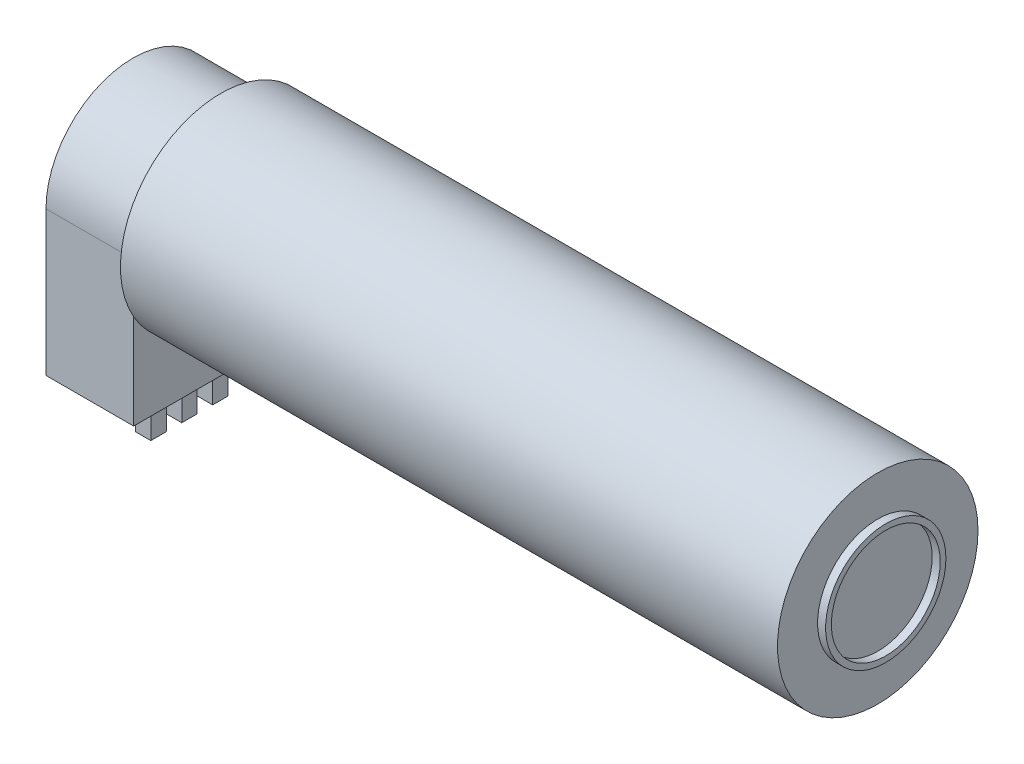
ISO-10303-21;
HEADER;
FILE_DESCRIPTION(('STEP AP214'),'2;1');
FILE_NAME('part.step','',(''),(''),'','','');
FILE_SCHEMA(('AUTOMOTIVE_DESIGN { 1 0 10303 214 1 1 1 1 }'));
ENDSEC;
DATA;
#1=APPLICATION_CONTEXT('core data for automotive mechanical design processes');
#2=APPLICATION_PROTOCOL_DEFINITION('international standard','automotive_design',2000,#1);
#3=PRODUCT_CONTEXT('',#1,'mechanical');
#4=PRODUCT('Part','Part','',(#3));
#5=PRODUCT_RELATED_PRODUCT_CATEGORY('part','',(#4));
#6=PRODUCT_DEFINITION_FORMATION('','',#4);
#7=PRODUCT_DEFINITION_CONTEXT('part definition',#1,'design');
#8=PRODUCT_DEFINITION('design','',#6,#7);
#9=PRODUCT_DEFINITION_SHAPE('','',#8);
#10=(LENGTH_UNIT() NAMED_UNIT(*) SI_UNIT(.MILLI.,.METRE.));
#11=(NAMED_UNIT(*) PLANE_ANGLE_UNIT() SI_UNIT($,.RADIAN.));
#12=(NAMED_UNIT(*) SI_UNIT($,.STERADIAN.) SOLID_ANGLE_UNIT());
#13=UNCERTAINTY_MEASURE_WITH_UNIT(LENGTH_MEASURE(1.E-05),#10,'distance_accuracy_value','');
#14=(GEOMETRIC_REPRESENTATION_CONTEXT(3) GLOBAL_UNCERTAINTY_ASSIGNED_CONTEXT((#13)) GLOBAL_UNIT_ASSIGNED_CONTEXT((#10,
#11,#12)) REPRESENTATION_CONTEXT('',''));
#15=CARTESIAN_POINT('',(0.,0.,0.));
#16=DIRECTION('',(0.,0.,1.));
#17=DIRECTION('',(1.,0.,0.));
#18=AXIS2_PLACEMENT_3D('',#15,#16,#17);
#19=CARTESIAN_POINT('',(-15.3,-25.2,-15.2));
#20=DIRECTION('',(0.,1.,0.));
#21=DIRECTION('',(0.,0.,1.));
#22=AXIS2_PLACEMENT_3D('',#19,#20,#21);
#23=PLANE('',#22);
#24=DIRECTION('',(1.,0.,0.));
#25=VECTOR('',#24,1.);
#26=CARTESIAN_POINT('',(-6.,-25.2,3.5));
#27=LINE('',#26,#25);
#28=CARTESIAN_POINT('',(-6.,-25.2,3.5));
#29=VERTEX_POINT('',#28);
#30=CARTESIAN_POINT('',(-5.3,-25.2,3.5));
#31=VERTEX_POINT('',#30);
#32=EDGE_CURVE('E211',#29,#31,#27,.T.);
#33=ORIENTED_EDGE('',*,*,#32,.F.);
#34=DIRECTION('',(0.,0.,1.));
#35=VECTOR('',#34,1.);
#36=CARTESIAN_POINT('',(-6.,-25.2,3.5));
#37=LINE('',#36,#35);
#38=CARTESIAN_POINT('',(-6.,-25.2,4.2));
#39=VERTEX_POINT('',#38);
#40=EDGE_CURVE('E219',#29,#39,#37,.T.);
#41=ORIENTED_EDGE('',*,*,#40,.T.);
#42=DIRECTION('',(1.,0.,0.));
#43=VECTOR('',#42,1.);
#44=CARTESIAN_POINT('',(-6.,-25.2,4.2));
#45=LINE('',#44,#43);
#46=CARTESIAN_POINT('',(-5.3,-25.2,4.2));
#47=VERTEX_POINT('',#46);
#48=EDGE_CURVE('E226',#39,#47,#45,.T.);
#49=ORIENTED_EDGE('',*,*,#48,.T.);
#50=DIRECTION('',(0.,0.,1.));
#51=VECTOR('',#50,1.);
#52=CARTESIAN_POINT('',(-5.3,-25.2,3.5));
#53=LINE('',#52,#51);
#54=EDGE_CURVE('E51',#31,#47,#53,.T.);
#55=ORIENTED_EDGE('',*,*,#54,.F.);
#56=EDGE_LOOP('',(#33,#41,#49,#55));
#57=FACE_BOUND('',#56,.T.);
#58=DIRECTION('',(1.,0.,0.));
#59=VECTOR('',#58,1.);
#60=CARTESIAN_POINT('',(-6.,-25.2,-1.9));
#61=LINE('',#60,#59);
#62=CARTESIAN_POINT('',(-6.,-25.2,-1.9));
#63=VERTEX_POINT('',#62);
#64=CARTESIAN_POINT('',(-5.3,-25.2,-1.9));
#65=VERTEX_POINT('',#64);
#66=EDGE_CURVE('E246',#63,#65,#61,.T.);
#67=ORIENTED_EDGE('',*,*,#66,.F.);
#68=DIRECTION('',(0.,0.,1.));
#69=VECTOR('',#68,1.);
#70=CARTESIAN_POINT('',(-6.,-25.2,-1.9));
#71=LINE('',#70,#69);
#72=CARTESIAN_POINT('',(-6.,-25.2,-1.2));
#73=VERTEX_POINT('',#72);
#74=EDGE_CURVE('E225',#63,#73,#71,.T.);
#75=ORIENTED_EDGE('',*,*,#74,.T.);
#76=DIRECTION('',(1.,0.,0.));
#77=VECTOR('',#76,1.);
#78=CARTESIAN_POINT('',(-6.,-25.2,-1.2));
#79=LINE('',#78,#77);
#80=CARTESIAN_POINT('',(-5.3,-25.2,-1.2));
#81=VERTEX_POINT('',#80);
#82=EDGE_CURVE('E256',#73,#81,#79,.T.);
#83=ORIENTED_EDGE('',*,*,#82,.T.);
#84=DIRECTION('',(0.,0.,1.));
#85=VECTOR('',#84,1.);
#86=CARTESIAN_POINT('',(-5.3,-25.2,-1.9));
#87=LINE('',#86,#85);
#88=EDGE_CURVE('E59',#65,#81,#87,.T.);
#89=ORIENTED_EDGE('',*,*,#88,.F.);
#90=EDGE_LOOP('',(#67,#75,#83,#89));
#91=FACE_BOUND('',#90,.T.);
#92=DIRECTION('',(1.,0.,0.));
#93=VECTOR('',#92,1.);
#94=CARTESIAN_POINT('',(-7.,-25.2,-0.199999999999999));
#95=LINE('',#94,#93);
#96=CARTESIAN_POINT('',(-7.,-25.2,-0.199999999999999));
#97=VERTEX_POINT('',#96);
#98=CARTESIAN_POINT('',(-4.3,-25.2,-0.199999999999999));
#99=VERTEX_POINT('',#98);
#100=EDGE_CURVE('E320',#97,#99,#95,.T.);
#101=ORIENTED_EDGE('',*,*,#100,.F.);
#102=DIRECTION('',(0.,0.,1.));
#103=VECTOR('',#102,1.);
#104=CARTESIAN_POINT('',(-7.,-25.2,-0.199999999999999));
#105=LINE('',#104,#103);
#106=CARTESIAN_POINT('',(-7.,-25.2,2.5));
#107=VERTEX_POINT('',#106);
#108=EDGE_CURVE('E310',#97,#107,#105,.T.);
#109=ORIENTED_EDGE('',*,*,#108,.T.);
#110=DIRECTION('',(1.,0.,0.));
#111=VECTOR('',#110,1.);
#112=CARTESIAN_POINT('',(-7.,-25.2,2.5));
#113=LINE('',#112,#111);
#114=CARTESIAN_POINT('',(-4.3,-25.2,2.5));
#115=VERTEX_POINT('',#114);
#116=EDGE_CURVE('E313',#107,#115,#113,.T.);
#117=ORIENTED_EDGE('',*,*,#116,.T.);
#118=DIRECTION('',(0.,0.,1.));
#119=VECTOR('',#118,1.);
#120=CARTESIAN_POINT('',(-4.3,-25.2,-0.199999999999999));
#121=LINE('',#120,#119);
#122=EDGE_CURVE('E317',#99,#115,#121,.T.);
#123=ORIENTED_EDGE('',*,*,#122,.F.);
#124=EDGE_LOOP('',(#101,#109,#117,#123));
#125=FACE_BOUND('',#124,.T.);
#126=DIRECTION('',(1.,0.,0.));
#127=VECTOR('',#126,1.);
#128=CARTESIAN_POINT('',(-7.,-25.2,5.2));
#129=LINE('',#128,#127);
#130=CARTESIAN_POINT('',(-7.,-25.2,5.2));
#131=VERTEX_POINT('',#130);
#132=CARTESIAN_POINT('',(-4.3,-25.2,5.2));
#133=VERTEX_POINT('',#132);
#134=EDGE_CURVE('E337',#131,#133,#129,.T.);
#135=ORIENTED_EDGE('',*,*,#134,.F.);
#136=DIRECTION('',(0.,0.,1.));
#137=VECTOR('',#136,1.);
#138=CARTESIAN_POINT('',(-7.,-25.2,5.2));
#139=LINE('',#138,#137);
#140=CARTESIAN_POINT('',(-7.,-25.2,7.9));
#141=VERTEX_POINT('',#140);
#142=EDGE_CURVE('E323',#131,#141,#139,.T.);
#143=ORIENTED_EDGE('',*,*,#142,.T.);
#144=DIRECTION('',(1.,0.,0.));
#145=VECTOR('',#144,1.);
#146=CARTESIAN_POINT('',(-7.,-25.2,7.9));
#147=LINE('',#146,#145);
#148=CARTESIAN_POINT('',(-4.3,-25.2,7.9));
#149=VERTEX_POINT('',#148);
#150=EDGE_CURVE('E347',#141,#149,#147,.T.);
#151=ORIENTED_EDGE('',*,*,#150,.T.);
#152=DIRECTION('',(0.,0.,1.));
#153=VECTOR('',#152,1.);
#154=CARTESIAN_POINT('',(-4.3,-25.2,5.2));
#155=LINE('',#154,#153);
#156=EDGE_CURVE('E350',#133,#149,#155,.T.);
#157=ORIENTED_EDGE('',*,*,#156,.F.);
#158=EDGE_LOOP('',(#135,#143,#151,#157));
#159=FACE_BOUND('',#158,.T.);
#160=DIRECTION('',(0.,0.,1.));
#161=VECTOR('',#160,1.);
#162=CARTESIAN_POINT('',(0.,-25.2,-15.2));
#163=LINE('',#162,#161);
#164=CARTESIAN_POINT('',(0.,-25.2,-15.2));
#165=VERTEX_POINT('',#164);
#166=CARTESIAN_POINT('',(0.,-25.2,15.2));
#167=VERTEX_POINT('',#166);
#168=EDGE_CURVE('E379',#165,#167,#163,.T.);
#169=ORIENTED_EDGE('',*,*,#168,.T.);
#170=DIRECTION('',(1.,0.,0.));
#171=VECTOR('',#170,1.);
#172=CARTESIAN_POINT('',(-15.3,-25.2,15.2));
#173=LINE('',#172,#171);
#174=CARTESIAN_POINT('',(-15.3,-25.2,15.2));
#175=VERTEX_POINT('',#174);
#176=EDGE_CURVE('E384',#175,#167,#173,.T.);
#177=ORIENTED_EDGE('',*,*,#176,.F.);
#178=DIRECTION('',(0.,0.,1.));
#179=VECTOR('',#178,1.);
#180=CARTESIAN_POINT('',(-15.3,-25.2,-15.2));
#181=LINE('',#180,#179);
#182=CARTESIAN_POINT('',(-15.3,-25.2,-15.2));
#183=VERTEX_POINT('',#182);
#184=EDGE_CURVE('E368',#183,#175,#181,.T.);
#185=ORIENTED_EDGE('',*,*,#184,.F.);
#186=DIRECTION('',(1.,0.,0.));
#187=VECTOR('',#186,1.);
#188=CARTESIAN_POINT('',(-15.3,-25.2,-15.2));
#189=LINE('',#188,#187);
#190=EDGE_CURVE('E387',#183,#165,#189,.T.);
#191=ORIENTED_EDGE('',*,*,#190,.T.);
#192=EDGE_LOOP('',(#169,#177,#185,#191));
#193=FACE_BOUND('',#192,.T.);
#194=DIRECTION('',(1.,0.,0.));
#195=VECTOR('',#194,1.);
#196=CARTESIAN_POINT('',(-7.,-25.2,-5.6));
#197=LINE('',#196,#195);
#198=CARTESIAN_POINT('',(-7.,-25.2,-5.6));
#199=VERTEX_POINT('',#198);
#200=CARTESIAN_POINT('',(-4.3,-25.2,-5.6));
#201=VERTEX_POINT('',#200);
#202=EDGE_CURVE('E288',#199,#201,#197,.T.);
#203=ORIENTED_EDGE('',*,*,#202,.F.);
#204=DIRECTION('',(0.,0.,1.));
#205=VECTOR('',#204,1.);
#206=CARTESIAN_POINT('',(-7.,-25.2,-5.6));
#207=LINE('',#206,#205);
#208=CARTESIAN_POINT('',(-7.,-25.2,-2.9));
#209=VERTEX_POINT('',#208);
#210=EDGE_CURVE('E278',#199,#209,#207,.T.);
#211=ORIENTED_EDGE('',*,*,#210,.T.);
#212=DIRECTION('',(1.,0.,0.));
#213=VECTOR('',#212,1.);
#214=CARTESIAN_POINT('',(-7.,-25.2,-2.9));
#215=LINE('',#214,#213);
#216=CARTESIAN_POINT('',(-4.3,-25.2,-2.9));
#217=VERTEX_POINT('',#216);
#218=EDGE_CURVE('E281',#209,#217,#215,.T.);
#219=ORIENTED_EDGE('',*,*,#218,.T.);
#220=DIRECTION('',(0.,0.,1.));
#221=VECTOR('',#220,1.);
#222=CARTESIAN_POINT('',(-4.3,-25.2,-5.6));
#223=LINE('',#222,#221);
#224=EDGE_CURVE('E285',#201,#217,#223,.T.);
#225=ORIENTED_EDGE('',*,*,#224,.F.);
#226=EDGE_LOOP('',(#203,#211,#219,#225));
#227=FACE_BOUND('',#226,.T.);
#228=ADVANCED_FACE('F34',(#57,#91,#125,#159,#193,#227),#23,.F.);
#229=CARTESIAN_POINT('',(0.,0.,0.));
#230=DIRECTION('',(1.,0.,0.));
#231=DIRECTION('',(0.,0.,-1.));
#232=AXIS2_PLACEMENT_3D('',#229,#230,#231);
#233=PLANE('',#232);
#234=DIRECTION('',(0.,1.,0.));
#235=VECTOR('',#234,1.);
#236=CARTESIAN_POINT('',(0.,-25.2,15.2));
#237=LINE('',#236,#235);
#238=CARTESIAN_POINT('',(0.,-8.67236991830954,15.2));
#239=VERTEX_POINT('',#238);
#240=CARTESIAN_POINT('',(0.,0.,15.2));
#241=VERTEX_POINT('',#240);
#242=EDGE_CURVE('E11',#239,#241,#237,.T.);
#243=ORIENTED_EDGE('',*,*,#242,.F.);
#244=CARTESIAN_POINT('',(0.,0.,0.));
#245=DIRECTION('',(1.,0.,0.));
#246=DIRECTION('',(0.,0.,-1.));
#247=AXIS2_PLACEMENT_3D('',#244,#245,#246);
#248=CIRCLE('',#247,17.5);
#249=CARTESIAN_POINT('',(0.,-8.67236991830954,-15.2));
#250=VERTEX_POINT('',#249);
#251=EDGE_CURVE('E400',#250,#239,#248,.T.);
#252=ORIENTED_EDGE('',*,*,#251,.F.);
#253=DIRECTION('',(0.,-1.,0.));
#254=VECTOR('',#253,1.);
#255=CARTESIAN_POINT('',(0.,0.,-15.2));
#256=LINE('',#255,#254);
#257=CARTESIAN_POINT('',(0.,0.,-15.2));
#258=VERTEX_POINT('',#257);
#259=EDGE_CURVE('E376',#258,#250,#256,.T.);
#260=ORIENTED_EDGE('',*,*,#259,.F.);
#261=CARTESIAN_POINT('',(0.,0.,0.));
#262=DIRECTION('',(-1.,0.,0.));
#263=DIRECTION('',(0.,0.,1.));
#264=AXIS2_PLACEMENT_3D('',#261,#262,#263);
#265=CIRCLE('',#264,15.2);
#266=EDGE_CURVE('E355',#241,#258,#265,.T.);
#267=ORIENTED_EDGE('',*,*,#266,.F.);
#268=EDGE_LOOP('',(#243,#252,#260,#267));
#269=FACE_BOUND('',#268,.T.);
#270=ADVANCED_FACE('F428',(#269),#233,.F.);
#271=CARTESIAN_POINT('',(114.7,0.,0.));
#272=DIRECTION('',(-1.,0.,0.));
#273=DIRECTION('',(0.,0.,1.));
#274=AXIS2_PLACEMENT_3D('',#271,#272,#273);
#275=CYLINDRICAL_SURFACE('',#274,17.5);
#276=CARTESIAN_POINT('',(114.7,0.,0.));
#277=DIRECTION('',(1.,0.,0.));
#278=DIRECTION('',(0.,0.,-1.));
#279=AXIS2_PLACEMENT_3D('',#276,#277,#278);
#280=CIRCLE('',#279,17.5);
#281=CARTESIAN_POINT('',(114.7,0.,-17.5));
#282=VERTEX_POINT('',#281);
#283=EDGE_CURVE('E403',#282,#282,#280,.T.);
#284=ORIENTED_EDGE('',*,*,#283,.F.);
#285=EDGE_LOOP('',(#284));
#286=FACE_BOUND('',#285,.T.);
#287=EDGE_CURVE('E405',#239,#250,#248,.T.);
#288=ORIENTED_EDGE('',*,*,#287,.T.);
#289=ORIENTED_EDGE('',*,*,#251,.T.);
#290=EDGE_LOOP('',(#288,#289));
#291=FACE_BOUND('',#290,.T.);
#292=ADVANCED_FACE('F36',(#286,#291),#275,.T.);
#293=CARTESIAN_POINT('',(114.7,0.,0.));
#294=DIRECTION('',(1.,0.,0.));
#295=DIRECTION('',(0.,0.,-1.));
#296=AXIS2_PLACEMENT_3D('',#293,#294,#295);
#297=PLANE('',#296);
#298=CARTESIAN_POINT('',(114.7,0.,0.));
#299=DIRECTION('',(1.,0.,0.));
#300=DIRECTION('',(0.,0.,-1.));
#301=AXIS2_PLACEMENT_3D('',#298,#299,#300);
#302=CIRCLE('',#301,10.5);
#303=CARTESIAN_POINT('',(114.7,0.,-10.5));
#304=VERTEX_POINT('',#303);
#305=EDGE_CURVE('E396',#304,#304,#302,.T.);
#306=ORIENTED_EDGE('',*,*,#305,.F.);
#307=EDGE_LOOP('',(#306));
#308=FACE_BOUND('',#307,.T.);
#309=ORIENTED_EDGE('',*,*,#283,.T.);
#310=EDGE_LOOP('',(#309));
#311=FACE_BOUND('',#310,.T.);
#312=ADVANCED_FACE('F463',(#308,#311),#297,.T.);
#313=CARTESIAN_POINT('',(116.1,0.,0.));
#314=DIRECTION('',(1.,0.,0.));
#315=DIRECTION('',(0.,0.,-1.));
#316=AXIS2_PLACEMENT_3D('',#313,#314,#315);
#317=PLANE('',#316);
#318=CARTESIAN_POINT('',(116.1,0.,0.));
#319=DIRECTION('',(1.,0.,0.));
#320=DIRECTION('',(0.,0.,-1.));
#321=AXIS2_PLACEMENT_3D('',#318,#319,#320);
#322=CIRCLE('',#321,10.5);
#323=CARTESIAN_POINT('',(116.1,0.,-10.5));
#324=VERTEX_POINT('',#323);
#325=EDGE_CURVE('E397',#324,#324,#322,.T.);
#326=ORIENTED_EDGE('',*,*,#325,.T.);
#327=EDGE_LOOP('',(#326));
#328=FACE_BOUND('',#327,.T.);
#329=CARTESIAN_POINT('',(116.1,0.,0.));
#330=DIRECTION('',(1.,0.,0.));
#331=DIRECTION('',(0.,0.,-1.));
#332=AXIS2_PLACEMENT_3D('',#329,#330,#331);
#333=CIRCLE('',#332,9.5);
#334=CARTESIAN_POINT('',(116.1,0.,-9.5));
#335=VERTEX_POINT('',#334);
#336=EDGE_CURVE('E393',#335,#335,#333,.T.);
#337=ORIENTED_EDGE('',*,*,#336,.F.);
#338=EDGE_LOOP('',(#337));
#339=FACE_BOUND('',#338,.T.);
#340=ADVANCED_FACE('F460',(#328,#339),#317,.T.);
#341=CARTESIAN_POINT('',(116.1,0.,0.));
#342=DIRECTION('',(-1.,0.,0.));
#343=DIRECTION('',(0.,0.,1.));
#344=AXIS2_PLACEMENT_3D('',#341,#342,#343);
#345=CYLINDRICAL_SURFACE('',#344,10.5);
#346=ORIENTED_EDGE('',*,*,#325,.F.);
#347=EDGE_LOOP('',(#346));
#348=FACE_BOUND('',#347,.T.);
#349=ORIENTED_EDGE('',*,*,#305,.T.);
#350=EDGE_LOOP('',(#349));
#351=FACE_BOUND('',#350,.T.);
#352=ADVANCED_FACE('F458',(#348,#351),#345,.T.);
#353=CARTESIAN_POINT('',(116.1,0.,0.));
#354=DIRECTION('',(-1.,0.,0.));
#355=DIRECTION('',(0.,0.,1.));
#356=AXIS2_PLACEMENT_3D('',#353,#354,#355);
#357=CYLINDRICAL_SURFACE('',#356,9.5);
#358=ORIENTED_EDGE('',*,*,#336,.T.);
#359=EDGE_LOOP('',(#358));
#360=FACE_BOUND('',#359,.T.);
#361=CARTESIAN_POINT('',(114.7,0.,0.));
#362=DIRECTION('',(1.,0.,0.));
#363=DIRECTION('',(0.,0.,-1.));
#364=AXIS2_PLACEMENT_3D('',#361,#362,#363);
#365=CIRCLE('',#364,9.5);
#366=CARTESIAN_POINT('',(114.7,0.,-9.5));
#367=VERTEX_POINT('',#366);
#368=EDGE_CURVE('E38',#367,#367,#365,.F.);
#369=ORIENTED_EDGE('',*,*,#368,.T.);
#370=EDGE_LOOP('',(#369));
#371=FACE_BOUND('',#370,.T.);
#372=ADVANCED_FACE('F455',(#360,#371),#357,.F.);
#373=ORIENTED_EDGE('',*,*,#368,.F.);
#374=EDGE_LOOP('',(#373));
#375=FACE_BOUND('',#374,.T.);
#376=ADVANCED_FACE('F454',(#375),#297,.T.);
#377=CARTESIAN_POINT('',(-15.3,0.,0.));
#378=DIRECTION('',(1.,0.,0.));
#379=DIRECTION('',(0.,0.,-1.));
#380=AXIS2_PLACEMENT_3D('',#377,#378,#379);
#381=CYLINDRICAL_SURFACE('',#380,15.2);
#382=ORIENTED_EDGE('',*,*,#266,.T.);
#383=DIRECTION('',(1.,0.,0.));
#384=VECTOR('',#383,1.);
#385=CARTESIAN_POINT('',(-15.3,0.,-15.2));
#386=LINE('',#385,#384);
#387=CARTESIAN_POINT('',(-15.3,0.,-15.2));
#388=VERTEX_POINT('',#387);
#389=EDGE_CURVE('E390',#388,#258,#386,.T.);
#390=ORIENTED_EDGE('',*,*,#389,.F.);
#391=CARTESIAN_POINT('',(-15.3,0.,0.));
#392=DIRECTION('',(-1.,0.,0.));
#393=DIRECTION('',(0.,0.,1.));
#394=AXIS2_PLACEMENT_3D('',#391,#392,#393);
#395=CIRCLE('',#394,15.2);
#396=CARTESIAN_POINT('',(-15.3,0.,15.2));
#397=VERTEX_POINT('',#396);
#398=EDGE_CURVE('E363',#397,#388,#395,.T.);
#399=ORIENTED_EDGE('',*,*,#398,.F.);
#400=DIRECTION('',(1.,0.,0.));
#401=VECTOR('',#400,1.);
#402=CARTESIAN_POINT('',(-15.3,0.,15.2));
#403=LINE('',#402,#401);
#404=EDGE_CURVE('E372',#397,#241,#403,.T.);
#405=ORIENTED_EDGE('',*,*,#404,.T.);
#406=EDGE_LOOP('',(#382,#390,#399,#405));
#407=FACE_BOUND('',#406,.T.);
#408=ADVANCED_FACE('F430',(#407),#381,.T.);
#409=CARTESIAN_POINT('',(-15.3,0.,-15.2));
#410=DIRECTION('',(0.,0.,1.));
#411=DIRECTION('',(0.,-1.,0.));
#412=AXIS2_PLACEMENT_3D('',#409,#410,#411);
#413=PLANE('',#412);
#414=ORIENTED_EDGE('',*,*,#259,.T.);
#415=EDGE_CURVE('E375',#250,#165,#256,.T.);
#416=ORIENTED_EDGE('',*,*,#415,.T.);
#417=ORIENTED_EDGE('',*,*,#190,.F.);
#418=DIRECTION('',(0.,-1.,0.));
#419=VECTOR('',#418,1.);
#420=CARTESIAN_POINT('',(-15.3,0.,-15.2));
#421=LINE('',#420,#419);
#422=EDGE_CURVE('E366',#388,#183,#421,.T.);
#423=ORIENTED_EDGE('',*,*,#422,.F.);
#424=ORIENTED_EDGE('',*,*,#389,.T.);
#425=EDGE_LOOP('',(#414,#416,#417,#423,#424));
#426=FACE_BOUND('',#425,.T.);
#427=ADVANCED_FACE('F426',(#426),#413,.F.);
#428=CARTESIAN_POINT('',(-15.3,-25.2,15.2));
#429=DIRECTION('',(0.,0.,-1.));
#430=DIRECTION('',(0.,1.,0.));
#431=AXIS2_PLACEMENT_3D('',#428,#429,#430);
#432=PLANE('',#431);
#433=EDGE_CURVE('E44',#167,#239,#237,.T.);
#434=ORIENTED_EDGE('',*,*,#433,.T.);
#435=ORIENTED_EDGE('',*,*,#242,.T.);
#436=ORIENTED_EDGE('',*,*,#404,.F.);
#437=DIRECTION('',(0.,1.,0.));
#438=VECTOR('',#437,1.);
#439=CARTESIAN_POINT('',(-15.3,-25.2,15.2));
#440=LINE('',#439,#438);
#441=EDGE_CURVE('E370',#175,#397,#440,.T.);
#442=ORIENTED_EDGE('',*,*,#441,.F.);
#443=ORIENTED_EDGE('',*,*,#176,.T.);
#444=EDGE_LOOP('',(#434,#435,#436,#442,#443));
#445=FACE_BOUND('',#444,.T.);
#446=ADVANCED_FACE('F417',(#445),#432,.F.);
#447=CARTESIAN_POINT('',(-15.3,0.,0.));
#448=DIRECTION('',(-1.,0.,0.));
#449=DIRECTION('',(0.,0.,1.));
#450=AXIS2_PLACEMENT_3D('',#447,#448,#449);
#451=PLANE('',#450);
#452=ORIENTED_EDGE('',*,*,#398,.T.);
#453=ORIENTED_EDGE('',*,*,#422,.T.);
#454=ORIENTED_EDGE('',*,*,#184,.T.);
#455=ORIENTED_EDGE('',*,*,#441,.T.);
#456=EDGE_LOOP('',(#452,#453,#454,#455));
#457=FACE_BOUND('',#456,.T.);
#458=ADVANCED_FACE('F433',(#457),#451,.T.);
#459=CARTESIAN_POINT('',(0.,0.,0.));
#460=DIRECTION('',(-1.,0.,0.));
#461=DIRECTION('',(0.,0.,1.));
#462=AXIS2_PLACEMENT_3D('',#459,#460,#461);
#463=PLANE('',#462);
#464=ORIENTED_EDGE('',*,*,#287,.F.);
#465=ORIENTED_EDGE('',*,*,#433,.F.);
#466=ORIENTED_EDGE('',*,*,#168,.F.);
#467=ORIENTED_EDGE('',*,*,#415,.F.);
#468=EDGE_LOOP('',(#464,#465,#466,#467));
#469=FACE_BOUND('',#468,.T.);
#470=ADVANCED_FACE('F414',(#469),#463,.F.);
#471=CARTESIAN_POINT('',(-7.,-33.2,5.2));
#472=DIRECTION('',(-1.,0.,0.));
#473=DIRECTION('',(0.,0.,1.));
#474=AXIS2_PLACEMENT_3D('',#471,#472,#473);
#475=PLANE('',#474);
#476=ORIENTED_EDGE('',*,*,#142,.F.);
#477=DIRECTION('',(0.,1.,0.));
#478=VECTOR('',#477,1.);
#479=CARTESIAN_POINT('',(-7.,-33.2,5.2));
#480=LINE('',#479,#478);
#481=CARTESIAN_POINT('',(-7.,-33.2,5.2));
#482=VERTEX_POINT('',#481);
#483=EDGE_CURVE('E353',#482,#131,#480,.T.);
#484=ORIENTED_EDGE('',*,*,#483,.F.);
#485=DIRECTION('',(0.,0.,1.));
#486=VECTOR('',#485,1.);
#487=CARTESIAN_POINT('',(-7.,-33.2,5.2));
#488=LINE('',#487,#486);
#489=CARTESIAN_POINT('',(-7.,-33.2,7.9));
#490=VERTEX_POINT('',#489);
#491=EDGE_CURVE('E333',#482,#490,#488,.T.);
#492=ORIENTED_EDGE('',*,*,#491,.T.);
#493=DIRECTION('',(0.,1.,0.));
#494=VECTOR('',#493,1.);
#495=CARTESIAN_POINT('',(-7.,-33.2,7.9));
#496=LINE('',#495,#494);
#497=EDGE_CURVE('E344',#490,#141,#496,.T.);
#498=ORIENTED_EDGE('',*,*,#497,.T.);
#499=EDGE_LOOP('',(#476,#484,#492,#498));
#500=FACE_BOUND('',#499,.T.);
#501=ADVANCED_FACE('F440',(#500),#475,.T.);
#502=CARTESIAN_POINT('',(-7.,-33.2,5.2));
#503=DIRECTION('',(0.,0.,1.));
#504=DIRECTION('',(1.,0.,0.));
#505=AXIS2_PLACEMENT_3D('',#502,#503,#504);
#506=PLANE('',#505);
#507=ORIENTED_EDGE('',*,*,#134,.T.);
#508=DIRECTION('',(0.,1.,0.));
#509=VECTOR('',#508,1.);
#510=CARTESIAN_POINT('',(-4.3,-33.2,5.2));
#511=LINE('',#510,#509);
#512=CARTESIAN_POINT('',(-4.3,-33.2,5.2));
#513=VERTEX_POINT('',#512);
#514=EDGE_CURVE('E356',#513,#133,#511,.T.);
#515=ORIENTED_EDGE('',*,*,#514,.F.);
#516=DIRECTION('',(1.,0.,0.));
#517=VECTOR('',#516,1.);
#518=CARTESIAN_POINT('',(-7.,-33.2,5.2));
#519=LINE('',#518,#517);
#520=EDGE_CURVE('E342',#482,#513,#519,.T.);
#521=ORIENTED_EDGE('',*,*,#520,.F.);
#522=ORIENTED_EDGE('',*,*,#483,.T.);
#523=EDGE_LOOP('',(#507,#515,#521,#522));
#524=FACE_BOUND('',#523,.T.);
#525=ADVANCED_FACE('F519',(#524),#506,.F.);
#526=CARTESIAN_POINT('',(-4.3,-33.2,5.2));
#527=DIRECTION('',(-1.,0.,0.));
#528=DIRECTION('',(0.,0.,1.));
#529=AXIS2_PLACEMENT_3D('',#526,#527,#528);
#530=PLANE('',#529);
#531=ORIENTED_EDGE('',*,*,#156,.T.);
#532=DIRECTION('',(0.,1.,0.));
#533=VECTOR('',#532,1.);
#534=CARTESIAN_POINT('',(-4.3,-33.2,7.9));
#535=LINE('',#534,#533);
#536=CARTESIAN_POINT('',(-4.3,-33.2,7.9));
#537=VERTEX_POINT('',#536);
#538=EDGE_CURVE('E359',#537,#149,#535,.T.);
#539=ORIENTED_EDGE('',*,*,#538,.F.);
#540=DIRECTION('',(0.,0.,1.));
#541=VECTOR('',#540,1.);
#542=CARTESIAN_POINT('',(-4.3,-33.2,5.2));
#543=LINE('',#542,#541);
#544=EDGE_CURVE('E340',#513,#537,#543,.T.);
#545=ORIENTED_EDGE('',*,*,#544,.F.);
#546=ORIENTED_EDGE('',*,*,#514,.T.);
#547=EDGE_LOOP('',(#531,#539,#545,#546));
#548=FACE_BOUND('',#547,.T.);
#549=ADVANCED_FACE('F528',(#548),#530,.F.);
#550=CARTESIAN_POINT('',(-7.,-33.2,7.9));
#551=DIRECTION('',(0.,0.,1.));
#552=DIRECTION('',(1.,0.,0.));
#553=AXIS2_PLACEMENT_3D('',#550,#551,#552);
#554=PLANE('',#553);
#555=ORIENTED_EDGE('',*,*,#150,.F.);
#556=ORIENTED_EDGE('',*,*,#497,.F.);
#557=DIRECTION('',(1.,0.,0.));
#558=VECTOR('',#557,1.);
#559=CARTESIAN_POINT('',(-7.,-33.2,7.9));
#560=LINE('',#559,#558);
#561=EDGE_CURVE('E336',#490,#537,#560,.T.);
#562=ORIENTED_EDGE('',*,*,#561,.T.);
#563=ORIENTED_EDGE('',*,*,#538,.T.);
#564=EDGE_LOOP('',(#555,#556,#562,#563));
#565=FACE_BOUND('',#564,.T.);
#566=ADVANCED_FACE('F538',(#565),#554,.T.);
#567=CARTESIAN_POINT('',(0.,-33.2,0.));
#568=DIRECTION('',(0.,1.,0.));
#569=DIRECTION('',(0.,0.,1.));
#570=AXIS2_PLACEMENT_3D('',#567,#568,#569);
#571=PLANE('',#570);
#572=ORIENTED_EDGE('',*,*,#491,.F.);
#573=ORIENTED_EDGE('',*,*,#520,.T.);
#574=ORIENTED_EDGE('',*,*,#544,.T.);
#575=ORIENTED_EDGE('',*,*,#561,.F.);
#576=EDGE_LOOP('',(#572,#573,#574,#575));
#577=FACE_BOUND('',#576,.T.);
#578=ADVANCED_FACE('F548',(#577),#571,.F.);
#579=CARTESIAN_POINT('',(-7.,-33.2,-0.199999999999999));
#580=DIRECTION('',(0.,0.,1.));
#581=DIRECTION('',(1.,0.,0.));
#582=AXIS2_PLACEMENT_3D('',#579,#580,#581);
#583=PLANE('',#582);
#584=ORIENTED_EDGE('',*,*,#100,.T.);
#585=DIRECTION('',(0.,1.,0.));
#586=VECTOR('',#585,1.);
#587=CARTESIAN_POINT('',(-4.3,-33.2,-0.199999999999999));
#588=LINE('',#587,#586);
#589=CARTESIAN_POINT('',(-4.3,-33.2,-0.199999999999999));
#590=VERTEX_POINT('',#589);
#591=EDGE_CURVE('E291',#590,#99,#588,.T.);
#592=ORIENTED_EDGE('',*,*,#591,.F.);
#593=DIRECTION('',(1.,0.,0.));
#594=VECTOR('',#593,1.);
#595=CARTESIAN_POINT('',(-7.,-33.2,-0.199999999999999));
#596=LINE('',#595,#594);
#597=CARTESIAN_POINT('',(-7.,-33.2,-0.199999999999999));
#598=VERTEX_POINT('',#597);
#599=EDGE_CURVE('E314',#598,#590,#596,.T.);
#600=ORIENTED_EDGE('',*,*,#599,.F.);
#601=DIRECTION('',(0.,1.,0.));
#602=VECTOR('',#601,1.);
#603=CARTESIAN_POINT('',(-7.,-33.2,-0.199999999999999));
#604=LINE('',#603,#602);
#605=EDGE_CURVE('E307',#598,#97,#604,.T.);
#606=ORIENTED_EDGE('',*,*,#605,.T.);
#607=EDGE_LOOP('',(#584,#592,#600,#606));
#608=FACE_BOUND('',#607,.T.);
#609=ADVANCED_FACE('F558',(#608),#583,.F.);
#610=CARTESIAN_POINT('',(-4.3,-33.2,-0.199999999999999));
#611=DIRECTION('',(-1.,0.,0.));
#612=DIRECTION('',(0.,0.,1.));
#613=AXIS2_PLACEMENT_3D('',#610,#611,#612);
#614=PLANE('',#613);
#615=ORIENTED_EDGE('',*,*,#122,.T.);
#616=DIRECTION('',(0.,1.,0.));
#617=VECTOR('',#616,1.);
#618=CARTESIAN_POINT('',(-4.3,-33.2,2.5));
#619=LINE('',#618,#617);
#620=CARTESIAN_POINT('',(-4.3,-33.2,2.5));
#621=VERTEX_POINT('',#620);
#622=EDGE_CURVE('E302',#621,#115,#619,.T.);
#623=ORIENTED_EDGE('',*,*,#622,.F.);
#624=DIRECTION('',(0.,0.,1.));
#625=VECTOR('',#624,1.);
#626=CARTESIAN_POINT('',(-4.3,-33.2,-0.199999999999999));
#627=LINE('',#626,#625);
#628=EDGE_CURVE('E329',#590,#621,#627,.T.);
#629=ORIENTED_EDGE('',*,*,#628,.F.);
#630=ORIENTED_EDGE('',*,*,#591,.T.);
#631=EDGE_LOOP('',(#615,#623,#629,#630));
#632=FACE_BOUND('',#631,.T.);
#633=ADVANCED_FACE('F568',(#632),#614,.F.);
#634=CARTESIAN_POINT('',(-7.,-33.2,2.5));
#635=DIRECTION('',(0.,0.,1.));
#636=DIRECTION('',(1.,0.,0.));
#637=AXIS2_PLACEMENT_3D('',#634,#635,#636);
#638=PLANE('',#637);
#639=ORIENTED_EDGE('',*,*,#116,.F.);
#640=DIRECTION('',(0.,1.,0.));
#641=VECTOR('',#640,1.);
#642=CARTESIAN_POINT('',(-7.,-33.2,2.5));
#643=LINE('',#642,#641);
#644=CARTESIAN_POINT('',(-7.,-33.2,2.5));
#645=VERTEX_POINT('',#644);
#646=EDGE_CURVE('E304',#645,#107,#643,.T.);
#647=ORIENTED_EDGE('',*,*,#646,.F.);
#648=DIRECTION('',(1.,0.,0.));
#649=VECTOR('',#648,1.);
#650=CARTESIAN_POINT('',(-7.,-33.2,2.5));
#651=LINE('',#650,#649);
#652=EDGE_CURVE('E326',#645,#621,#651,.T.);
#653=ORIENTED_EDGE('',*,*,#652,.T.);
#654=ORIENTED_EDGE('',*,*,#622,.T.);
#655=EDGE_LOOP('',(#639,#647,#653,#654));
#656=FACE_BOUND('',#655,.T.);
#657=ADVANCED_FACE('F578',(#656),#638,.T.);
#658=CARTESIAN_POINT('',(-7.,-33.2,-0.199999999999999));
#659=DIRECTION('',(-1.,0.,0.));
#660=DIRECTION('',(0.,0.,1.));
#661=AXIS2_PLACEMENT_3D('',#658,#659,#660);
#662=PLANE('',#661);
#663=ORIENTED_EDGE('',*,*,#108,.F.);
#664=ORIENTED_EDGE('',*,*,#605,.F.);
#665=DIRECTION('',(0.,0.,1.));
#666=VECTOR('',#665,1.);
#667=CARTESIAN_POINT('',(-7.,-33.2,-0.199999999999999));
#668=LINE('',#667,#666);
#669=EDGE_CURVE('E309',#598,#645,#668,.T.);
#670=ORIENTED_EDGE('',*,*,#669,.T.);
#671=ORIENTED_EDGE('',*,*,#646,.T.);
#672=EDGE_LOOP('',(#663,#664,#670,#671));
#673=FACE_BOUND('',#672,.T.);
#674=ADVANCED_FACE('F588',(#673),#662,.T.);
#675=CARTESIAN_POINT('',(0.,-33.2,0.));
#676=DIRECTION('',(0.,-1.,0.));
#677=DIRECTION('',(0.,0.,-1.));
#678=AXIS2_PLACEMENT_3D('',#675,#676,#677);
#679=PLANE('',#678);
#680=ORIENTED_EDGE('',*,*,#599,.T.);
#681=ORIENTED_EDGE('',*,*,#628,.T.);
#682=ORIENTED_EDGE('',*,*,#652,.F.);
#683=ORIENTED_EDGE('',*,*,#669,.F.);
#684=EDGE_LOOP('',(#680,#681,#682,#683));
#685=FACE_BOUND('',#684,.T.);
#686=ADVANCED_FACE('F598',(#685),#679,.T.);
#687=CARTESIAN_POINT('',(-7.,-33.2,-5.6));
#688=DIRECTION('',(0.,0.,1.));
#689=DIRECTION('',(1.,0.,0.));
#690=AXIS2_PLACEMENT_3D('',#687,#688,#689);
#691=PLANE('',#690);
#692=ORIENTED_EDGE('',*,*,#202,.T.);
#693=DIRECTION('',(0.,1.,0.));
#694=VECTOR('',#693,1.);
#695=CARTESIAN_POINT('',(-4.3,-33.2,-5.6));
#696=LINE('',#695,#694);
#697=CARTESIAN_POINT('',(-4.3,-33.2,-5.6));
#698=VERTEX_POINT('',#697);
#699=EDGE_CURVE('E263',#698,#201,#696,.T.);
#700=ORIENTED_EDGE('',*,*,#699,.F.);
#701=DIRECTION('',(1.,0.,0.));
#702=VECTOR('',#701,1.);
#703=CARTESIAN_POINT('',(-7.,-33.2,-5.6));
#704=LINE('',#703,#702);
#705=CARTESIAN_POINT('',(-7.,-33.2,-5.6));
#706=VERTEX_POINT('',#705);
#707=EDGE_CURVE('E282',#706,#698,#704,.T.);
#708=ORIENTED_EDGE('',*,*,#707,.F.);
#709=DIRECTION('',(0.,1.,0.));
#710=VECTOR('',#709,1.);
#711=CARTESIAN_POINT('',(-7.,-33.2,-5.6));
#712=LINE('',#711,#710);
#713=EDGE_CURVE('E275',#706,#199,#712,.T.);
#714=ORIENTED_EDGE('',*,*,#713,.T.);
#715=EDGE_LOOP('',(#692,#700,#708,#714));
#716=FACE_BOUND('',#715,.T.);
#717=ADVANCED_FACE('F608',(#716),#691,.F.);
#718=CARTESIAN_POINT('',(-4.3,-33.2,-5.6));
#719=DIRECTION('',(-1.,0.,0.));
#720=DIRECTION('',(0.,0.,1.));
#721=AXIS2_PLACEMENT_3D('',#718,#719,#720);
#722=PLANE('',#721);
#723=ORIENTED_EDGE('',*,*,#224,.T.);
#724=DIRECTION('',(0.,1.,0.));
#725=VECTOR('',#724,1.);
#726=CARTESIAN_POINT('',(-4.3,-33.2,-2.9));
#727=LINE('',#726,#725);
#728=CARTESIAN_POINT('',(-4.3,-33.2,-2.9));
#729=VERTEX_POINT('',#728);
#730=EDGE_CURVE('E270',#729,#217,#727,.T.);
#731=ORIENTED_EDGE('',*,*,#730,.F.);
#732=DIRECTION('',(0.,0.,1.));
#733=VECTOR('',#732,1.);
#734=CARTESIAN_POINT('',(-4.3,-33.2,-5.6));
#735=LINE('',#734,#733);
#736=EDGE_CURVE('E297',#698,#729,#735,.T.);
#737=ORIENTED_EDGE('',*,*,#736,.F.);
#738=ORIENTED_EDGE('',*,*,#699,.T.);
#739=EDGE_LOOP('',(#723,#731,#737,#738));
#740=FACE_BOUND('',#739,.T.);
#741=ADVANCED_FACE('F618',(#740),#722,.F.);
#742=CARTESIAN_POINT('',(-7.,-33.2,-2.9));
#743=DIRECTION('',(0.,0.,1.));
#744=DIRECTION('',(1.,0.,0.));
#745=AXIS2_PLACEMENT_3D('',#742,#743,#744);
#746=PLANE('',#745);
#747=ORIENTED_EDGE('',*,*,#218,.F.);
#748=DIRECTION('',(0.,1.,0.));
#749=VECTOR('',#748,1.);
#750=CARTESIAN_POINT('',(-7.,-33.2,-2.9));
#751=LINE('',#750,#749);
#752=CARTESIAN_POINT('',(-7.,-33.2,-2.9));
#753=VERTEX_POINT('',#752);
#754=EDGE_CURVE('E272',#753,#209,#751,.T.);
#755=ORIENTED_EDGE('',*,*,#754,.F.);
#756=DIRECTION('',(1.,0.,0.));
#757=VECTOR('',#756,1.);
#758=CARTESIAN_POINT('',(-7.,-33.2,-2.9));
#759=LINE('',#758,#757);
#760=EDGE_CURVE('E294',#753,#729,#759,.T.);
#761=ORIENTED_EDGE('',*,*,#760,.T.);
#762=ORIENTED_EDGE('',*,*,#730,.T.);
#763=EDGE_LOOP('',(#747,#755,#761,#762));
#764=FACE_BOUND('',#763,.T.);
#765=ADVANCED_FACE('F628',(#764),#746,.T.);
#766=CARTESIAN_POINT('',(-7.,-33.2,-5.6));
#767=DIRECTION('',(-1.,0.,0.));
#768=DIRECTION('',(0.,0.,1.));
#769=AXIS2_PLACEMENT_3D('',#766,#767,#768);
#770=PLANE('',#769);
#771=ORIENTED_EDGE('',*,*,#210,.F.);
#772=ORIENTED_EDGE('',*,*,#713,.F.);
#773=DIRECTION('',(0.,0.,1.));
#774=VECTOR('',#773,1.);
#775=CARTESIAN_POINT('',(-7.,-33.2,-5.6));
#776=LINE('',#775,#774);
#777=EDGE_CURVE('E277',#706,#753,#776,.T.);
#778=ORIENTED_EDGE('',*,*,#777,.T.);
#779=ORIENTED_EDGE('',*,*,#754,.T.);
#780=EDGE_LOOP('',(#771,#772,#778,#779));
#781=FACE_BOUND('',#780,.T.);
#782=ADVANCED_FACE('F638',(#781),#770,.T.);
#783=CARTESIAN_POINT('',(0.,-33.2,0.));
#784=DIRECTION('',(0.,-1.,0.));
#785=DIRECTION('',(0.,0.,-1.));
#786=AXIS2_PLACEMENT_3D('',#783,#784,#785);
#787=PLANE('',#786);
#788=ORIENTED_EDGE('',*,*,#707,.T.);
#789=ORIENTED_EDGE('',*,*,#736,.T.);
#790=ORIENTED_EDGE('',*,*,#760,.F.);
#791=ORIENTED_EDGE('',*,*,#777,.F.);
#792=EDGE_LOOP('',(#788,#789,#790,#791));
#793=FACE_BOUND('',#792,.T.);
#794=ADVANCED_FACE('F648',(#793),#787,.T.);
#795=CARTESIAN_POINT('',(-6.,-27.2,-1.9));
#796=DIRECTION('',(-1.,0.,0.));
#797=DIRECTION('',(0.,0.,1.));
#798=AXIS2_PLACEMENT_3D('',#795,#796,#797);
#799=PLANE('',#798);
#800=ORIENTED_EDGE('',*,*,#74,.F.);
#801=DIRECTION('',(0.,1.,0.));
#802=VECTOR('',#801,1.);
#803=CARTESIAN_POINT('',(-6.,-27.2,-1.9));
#804=LINE('',#803,#802);
#805=CARTESIAN_POINT('',(-6.,-27.2,-1.9));
#806=VERTEX_POINT('',#805);
#807=EDGE_CURVE('E261',#806,#63,#804,.T.);
#808=ORIENTED_EDGE('',*,*,#807,.F.);
#809=DIRECTION('',(0.,0.,1.));
#810=VECTOR('',#809,1.);
#811=CARTESIAN_POINT('',(-6.,-27.2,-1.9));
#812=LINE('',#811,#810);
#813=CARTESIAN_POINT('',(-6.,-27.2,-1.2));
#814=VERTEX_POINT('',#813);
#815=EDGE_CURVE('E242',#806,#814,#812,.T.);
#816=ORIENTED_EDGE('',*,*,#815,.T.);
#817=DIRECTION('',(0.,1.,0.));
#818=VECTOR('',#817,1.);
#819=CARTESIAN_POINT('',(-6.,-27.2,-1.2));
#820=LINE('',#819,#818);
#821=EDGE_CURVE('E253',#814,#73,#820,.T.);
#822=ORIENTED_EDGE('',*,*,#821,.T.);
#823=EDGE_LOOP('',(#800,#808,#816,#822));
#824=FACE_BOUND('',#823,.T.);
#825=ADVANCED_FACE('F657',(#824),#799,.T.);
#826=CARTESIAN_POINT('',(-6.,-27.2,-1.9));
#827=DIRECTION('',(0.,0.,1.));
#828=DIRECTION('',(1.,0.,0.));
#829=AXIS2_PLACEMENT_3D('',#826,#827,#828);
#830=PLANE('',#829);
#831=ORIENTED_EDGE('',*,*,#66,.T.);
#832=DIRECTION('',(0.,1.,0.));
#833=VECTOR('',#832,1.);
#834=CARTESIAN_POINT('',(-5.3,-27.2,-1.9));
#835=LINE('',#834,#833);
#836=CARTESIAN_POINT('',(-5.3,-27.2,-1.9));
#837=VERTEX_POINT('',#836);
#838=EDGE_CURVE('E264',#837,#65,#835,.T.);
#839=ORIENTED_EDGE('',*,*,#838,.F.);
#840=DIRECTION('',(1.,0.,0.));
#841=VECTOR('',#840,1.);
#842=CARTESIAN_POINT('',(-6.,-27.2,-1.9));
#843=LINE('',#842,#841);
#844=EDGE_CURVE('E251',#806,#837,#843,.T.);
#845=ORIENTED_EDGE('',*,*,#844,.F.);
#846=ORIENTED_EDGE('',*,*,#807,.T.);
#847=EDGE_LOOP('',(#831,#839,#845,#846));
#848=FACE_BOUND('',#847,.T.);
#849=ADVANCED_FACE('F671',(#848),#830,.F.);
#850=CARTESIAN_POINT('',(-5.3,-27.2,-1.9));
#851=DIRECTION('',(-1.,0.,0.));
#852=DIRECTION('',(0.,0.,1.));
#853=AXIS2_PLACEMENT_3D('',#850,#851,#852);
#854=PLANE('',#853);
#855=ORIENTED_EDGE('',*,*,#88,.T.);
#856=DIRECTION('',(0.,1.,0.));
#857=VECTOR('',#856,1.);
#858=CARTESIAN_POINT('',(-5.3,-27.2,-1.2));
#859=LINE('',#858,#857);
#860=CARTESIAN_POINT('',(-5.3,-27.2,-1.2));
#861=VERTEX_POINT('',#860);
#862=EDGE_CURVE('E266',#861,#81,#859,.T.);
#863=ORIENTED_EDGE('',*,*,#862,.F.);
#864=DIRECTION('',(0.,0.,1.));
#865=VECTOR('',#864,1.);
#866=CARTESIAN_POINT('',(-5.3,-27.2,-1.9));
#867=LINE('',#866,#865);
#868=EDGE_CURVE('E249',#837,#861,#867,.T.);
#869=ORIENTED_EDGE('',*,*,#868,.F.);
#870=ORIENTED_EDGE('',*,*,#838,.T.);
#871=EDGE_LOOP('',(#855,#863,#869,#870));
#872=FACE_BOUND('',#871,.T.);
#873=ADVANCED_FACE('F681',(#872),#854,.F.);
#874=CARTESIAN_POINT('',(-6.,-27.2,-1.2));
#875=DIRECTION('',(0.,0.,1.));
#876=DIRECTION('',(1.,0.,0.));
#877=AXIS2_PLACEMENT_3D('',#874,#875,#876);
#878=PLANE('',#877);
#879=ORIENTED_EDGE('',*,*,#82,.F.);
#880=ORIENTED_EDGE('',*,*,#821,.F.);
#881=DIRECTION('',(1.,0.,0.));
#882=VECTOR('',#881,1.);
#883=CARTESIAN_POINT('',(-6.,-27.2,-1.2));
#884=LINE('',#883,#882);
#885=EDGE_CURVE('E245',#814,#861,#884,.T.);
#886=ORIENTED_EDGE('',*,*,#885,.T.);
#887=ORIENTED_EDGE('',*,*,#862,.T.);
#888=EDGE_LOOP('',(#879,#880,#886,#887));
#889=FACE_BOUND('',#888,.T.);
#890=ADVANCED_FACE('F691',(#889),#878,.T.);
#891=CARTESIAN_POINT('',(0.,-27.2,0.));
#892=DIRECTION('',(0.,1.,0.));
#893=DIRECTION('',(0.,0.,1.));
#894=AXIS2_PLACEMENT_3D('',#891,#892,#893);
#895=PLANE('',#894);
#896=ORIENTED_EDGE('',*,*,#815,.F.);
#897=ORIENTED_EDGE('',*,*,#844,.T.);
#898=ORIENTED_EDGE('',*,*,#868,.T.);
#899=ORIENTED_EDGE('',*,*,#885,.F.);
#900=EDGE_LOOP('',(#896,#897,#898,#899));
#901=FACE_BOUND('',#900,.T.);
#902=ADVANCED_FACE('F700',(#901),#895,.F.);
#903=CARTESIAN_POINT('',(-6.,-27.2,3.5));
#904=DIRECTION('',(-1.,0.,0.));
#905=DIRECTION('',(0.,0.,1.));
#906=AXIS2_PLACEMENT_3D('',#903,#904,#905);
#907=PLANE('',#906);
#908=ORIENTED_EDGE('',*,*,#40,.F.);
#909=DIRECTION('',(0.,1.,0.));
#910=VECTOR('',#909,1.);
#911=CARTESIAN_POINT('',(-6.,-27.2,3.5));
#912=LINE('',#911,#910);
#913=CARTESIAN_POINT('',(-6.,-27.2,3.5));
#914=VERTEX_POINT('',#913);
#915=EDGE_CURVE('E206',#914,#29,#912,.T.);
#916=ORIENTED_EDGE('',*,*,#915,.F.);
#917=DIRECTION('',(0.,0.,1.));
#918=VECTOR('',#917,1.);
#919=CARTESIAN_POINT('',(-6.,-27.2,3.5));
#920=LINE('',#919,#918);
#921=CARTESIAN_POINT('',(-6.,-27.2,4.2));
#922=VERTEX_POINT('',#921);
#923=EDGE_CURVE('E229',#914,#922,#920,.T.);
#924=ORIENTED_EDGE('',*,*,#923,.T.);
#925=DIRECTION('',(0.,1.,0.));
#926=VECTOR('',#925,1.);
#927=CARTESIAN_POINT('',(-6.,-27.2,4.2));
#928=LINE('',#927,#926);
#929=EDGE_CURVE('E221',#922,#39,#928,.T.);
#930=ORIENTED_EDGE('',*,*,#929,.T.);
#931=EDGE_LOOP('',(#908,#916,#924,#930));
#932=FACE_BOUND('',#931,.T.);
#933=ADVANCED_FACE('F220',(#932),#907,.T.);
#934=CARTESIAN_POINT('',(-6.,-27.2,3.5));
#935=DIRECTION('',(0.,0.,1.));
#936=DIRECTION('',(1.,0.,0.));
#937=AXIS2_PLACEMENT_3D('',#934,#935,#936);
#938=PLANE('',#937);
#939=ORIENTED_EDGE('',*,*,#32,.T.);
#940=DIRECTION('',(0.,1.,0.));
#941=VECTOR('',#940,1.);
#942=CARTESIAN_POINT('',(-5.3,-27.2,3.5));
#943=LINE('',#942,#941);
#944=CARTESIAN_POINT('',(-5.3,-27.2,3.5));
#945=VERTEX_POINT('',#944);
#946=EDGE_CURVE('E216',#945,#31,#943,.T.);
#947=ORIENTED_EDGE('',*,*,#946,.F.);
#948=DIRECTION('',(1.,0.,0.));
#949=VECTOR('',#948,1.);
#950=CARTESIAN_POINT('',(-6.,-27.2,3.5));
#951=LINE('',#950,#949);
#952=EDGE_CURVE('E212',#914,#945,#951,.T.);
#953=ORIENTED_EDGE('',*,*,#952,.F.);
#954=ORIENTED_EDGE('',*,*,#915,.T.);
#955=EDGE_LOOP('',(#939,#947,#953,#954));
#956=FACE_BOUND('',#955,.T.);
#957=ADVANCED_FACE('F208',(#956),#938,.F.);
#958=CARTESIAN_POINT('',(-5.3,-27.2,3.5));
#959=DIRECTION('',(-1.,0.,0.));
#960=DIRECTION('',(0.,0.,1.));
#961=AXIS2_PLACEMENT_3D('',#958,#959,#960);
#962=PLANE('',#961);
#963=ORIENTED_EDGE('',*,*,#54,.T.);
#964=DIRECTION('',(0.,1.,0.));
#965=VECTOR('',#964,1.);
#966=CARTESIAN_POINT('',(-5.3,-27.2,4.2));
#967=LINE('',#966,#965);
#968=CARTESIAN_POINT('',(-5.3,-27.2,4.2));
#969=VERTEX_POINT('',#968);
#970=EDGE_CURVE('E761',#969,#47,#967,.T.);
#971=ORIENTED_EDGE('',*,*,#970,.F.);
#972=DIRECTION('',(0.,0.,1.));
#973=VECTOR('',#972,1.);
#974=CARTESIAN_POINT('',(-5.3,-27.2,3.5));
#975=LINE('',#974,#973);
#976=EDGE_CURVE('E238',#945,#969,#975,.T.);
#977=ORIENTED_EDGE('',*,*,#976,.F.);
#978=ORIENTED_EDGE('',*,*,#946,.T.);
#979=EDGE_LOOP('',(#963,#971,#977,#978));
#980=FACE_BOUND('',#979,.T.);
#981=ADVANCED_FACE('F727',(#980),#962,.F.);
#982=CARTESIAN_POINT('',(-6.,-27.2,4.2));
#983=DIRECTION('',(0.,0.,1.));
#984=DIRECTION('',(1.,0.,0.));
#985=AXIS2_PLACEMENT_3D('',#982,#983,#984);
#986=PLANE('',#985);
#987=ORIENTED_EDGE('',*,*,#48,.F.);
#988=ORIENTED_EDGE('',*,*,#929,.F.);
#989=DIRECTION('',(1.,0.,0.));
#990=VECTOR('',#989,1.);
#991=CARTESIAN_POINT('',(-6.,-27.2,4.2));
#992=LINE('',#991,#990);
#993=EDGE_CURVE('E232',#922,#969,#992,.T.);
#994=ORIENTED_EDGE('',*,*,#993,.T.);
#995=ORIENTED_EDGE('',*,*,#970,.T.);
#996=EDGE_LOOP('',(#987,#988,#994,#995));
#997=FACE_BOUND('',#996,.T.);
#998=ADVANCED_FACE('F736',(#997),#986,.T.);
#999=CARTESIAN_POINT('',(0.,-27.2,0.));
#1000=DIRECTION('',(0.,1.,0.));
#1001=DIRECTION('',(0.,0.,1.));
#1002=AXIS2_PLACEMENT_3D('',#999,#1000,#1001);
#1003=PLANE('',#1002);
#1004=ORIENTED_EDGE('',*,*,#923,.F.);
#1005=ORIENTED_EDGE('',*,*,#952,.T.);
#1006=ORIENTED_EDGE('',*,*,#976,.T.);
#1007=ORIENTED_EDGE('',*,*,#993,.F.);
#1008=EDGE_LOOP('',(#1004,#1005,#1006,#1007));
#1009=FACE_BOUND('',#1008,.T.);
#1010=ADVANCED_FACE('F745',(#1009),#1003,.F.);
#1011=CLOSED_SHELL('',(#228,#270,#292,#312,#340,#352,#372,#376,#408,#427,#446,#458,#470,#501,
#525,#549,#566,#578,#609,#633,#657,#674,#686,#717,#741,#765,#782,#794,#825,#849,#873,#890,#902,
#933,#957,#981,#998,#1010));
#1012=MANIFOLD_SOLID_BREP('B2',#1011);
#1013=ADVANCED_BREP_SHAPE_REPRESENTATION('',(#18,#1012),#14);
#1014=SHAPE_DEFINITION_REPRESENTATION(#9,#1013);
ENDSEC;
END-ISO-10303-21;
